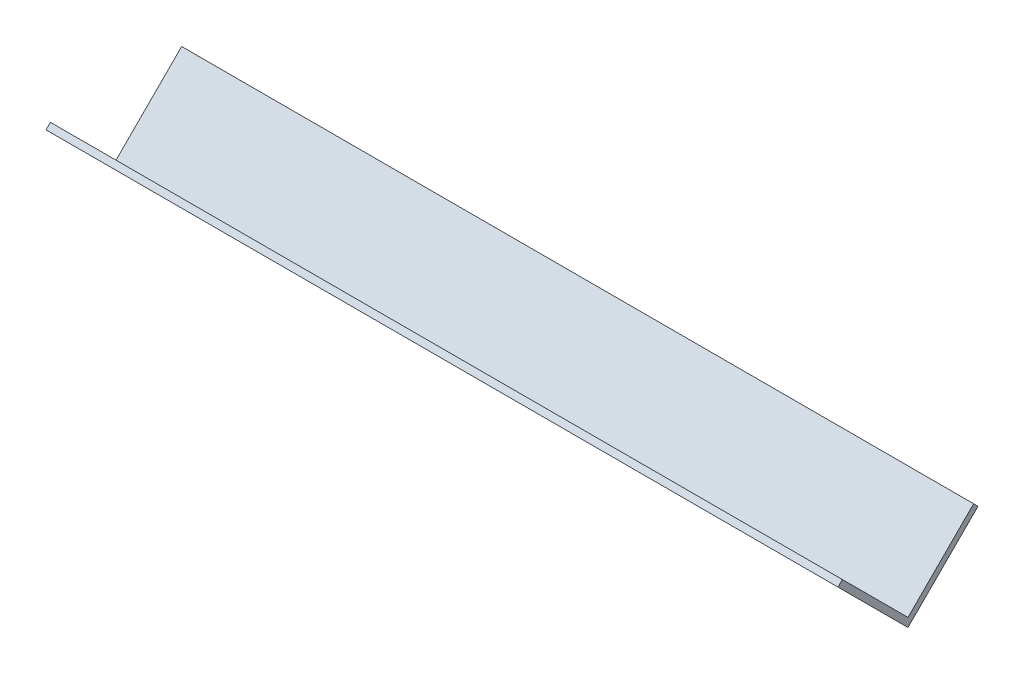
ISO-10303-21;
HEADER;
FILE_DESCRIPTION(('STEP AP214'),'2;1');
FILE_NAME('part.step','',(''),(''),'','','');
FILE_SCHEMA(('AUTOMOTIVE_DESIGN { 1 0 10303 214 1 1 1 1 }'));
ENDSEC;
DATA;
#1=APPLICATION_CONTEXT('core data for automotive mechanical design processes');
#2=APPLICATION_PROTOCOL_DEFINITION('international standard','automotive_design',2000,#1);
#3=PRODUCT_CONTEXT('',#1,'mechanical');
#4=PRODUCT('Part','Part','',(#3));
#5=PRODUCT_RELATED_PRODUCT_CATEGORY('part','',(#4));
#6=PRODUCT_DEFINITION_FORMATION('','',#4);
#7=PRODUCT_DEFINITION_CONTEXT('part definition',#1,'design');
#8=PRODUCT_DEFINITION('design','',#6,#7);
#9=PRODUCT_DEFINITION_SHAPE('','',#8);
#10=(LENGTH_UNIT() NAMED_UNIT(*) SI_UNIT(.MILLI.,.METRE.));
#11=(NAMED_UNIT(*) PLANE_ANGLE_UNIT() SI_UNIT($,.RADIAN.));
#12=(NAMED_UNIT(*) SI_UNIT($,.STERADIAN.) SOLID_ANGLE_UNIT());
#13=UNCERTAINTY_MEASURE_WITH_UNIT(LENGTH_MEASURE(1.E-05),#10,'distance_accuracy_value','');
#14=(GEOMETRIC_REPRESENTATION_CONTEXT(3) GLOBAL_UNCERTAINTY_ASSIGNED_CONTEXT((#13)) GLOBAL_UNIT_ASSIGNED_CONTEXT((#10,
#11,#12)) REPRESENTATION_CONTEXT('',''));
#15=CARTESIAN_POINT('',(0.,0.,0.));
#16=DIRECTION('',(0.,0.,1.));
#17=DIRECTION('',(1.,0.,0.));
#18=AXIS2_PLACEMENT_3D('',#15,#16,#17);
#19=CARTESIAN_POINT('',(406.4,35.9210244842766,-35.9210244842766));
#20=DIRECTION('',(0.,0.707106781186548,0.707106781186548));
#21=DIRECTION('',(0.,-0.707106781186548,0.707106781186548));
#22=AXIS2_PLACEMENT_3D('',#19,#20,#21);
#23=PLANE('',#22);
#24=DIRECTION('',(0.,0.707106781186548,-0.707106781186548));
#25=VECTOR('',#24,1.);
#26=CARTESIAN_POINT('',(0.,35.9210244842766,-35.9210244842766));
#27=LINE('',#26,#25);
#28=CARTESIAN_POINT('',(0.,0.,0.));
#29=VERTEX_POINT('',#28);
#30=CARTESIAN_POINT('',(0.,35.9210244842766,-35.9210244842766));
#31=VERTEX_POINT('',#30);
#32=EDGE_CURVE('E116',#29,#31,#27,.T.);
#33=ORIENTED_EDGE('',*,*,#32,.T.);
#34=DIRECTION('',(-1.,0.,0.));
#35=VECTOR('',#34,1.);
#36=CARTESIAN_POINT('',(406.4,35.9210244842766,-35.9210244842766));
#37=LINE('',#36,#35);
#38=CARTESIAN_POINT('',(406.4,35.9210244842766,-35.9210244842766));
#39=VERTEX_POINT('',#38);
#40=EDGE_CURVE('E11',#39,#31,#37,.T.);
#41=ORIENTED_EDGE('',*,*,#40,.F.);
#42=DIRECTION('',(0.,0.707106781186548,-0.707106781186548));
#43=VECTOR('',#42,1.);
#44=CARTESIAN_POINT('',(406.4,35.9210244842766,-35.9210244842766));
#45=LINE('',#44,#43);
#46=CARTESIAN_POINT('',(406.4,0.,0.));
#47=VERTEX_POINT('',#46);
#48=EDGE_CURVE('E126',#47,#39,#45,.T.);
#49=ORIENTED_EDGE('',*,*,#48,.F.);
#50=DIRECTION('',(-1.,0.,0.));
#51=VECTOR('',#50,1.);
#52=CARTESIAN_POINT('',(406.4,0.,0.));
#53=LINE('',#52,#51);
#54=EDGE_CURVE('E112',#47,#29,#53,.T.);
#55=ORIENTED_EDGE('',*,*,#54,.T.);
#56=EDGE_LOOP('',(#33,#41,#49,#55));
#57=FACE_BOUND('',#56,.T.);
#58=ADVANCED_FACE('F32',(#57),#23,.F.);
#59=CARTESIAN_POINT('',(406.4,38.1660885145439,-33.6759604540093));
#60=DIRECTION('',(0.,-0.707106781186548,0.707106781186548));
#61=DIRECTION('',(0.,-0.707106781186548,-0.707106781186548));
#62=AXIS2_PLACEMENT_3D('',#59,#60,#61);
#63=PLANE('',#62);
#64=DIRECTION('',(0.,0.707106781186548,0.707106781186548));
#65=VECTOR('',#64,1.);
#66=CARTESIAN_POINT('',(0.,38.1660885145439,-33.6759604540093));
#67=LINE('',#66,#65);
#68=CARTESIAN_POINT('',(0.,38.1660885145439,-33.6759604540093));
#69=VERTEX_POINT('',#68);
#70=EDGE_CURVE('E119',#31,#69,#67,.T.);
#71=ORIENTED_EDGE('',*,*,#70,.T.);
#72=DIRECTION('',(-1.,0.,0.));
#73=VECTOR('',#72,1.);
#74=CARTESIAN_POINT('',(406.4,38.1660885145439,-33.6759604540093));
#75=LINE('',#74,#73);
#76=CARTESIAN_POINT('',(406.4,38.1660885145439,-33.6759604540093));
#77=VERTEX_POINT('',#76);
#78=EDGE_CURVE('E40',#77,#69,#75,.T.);
#79=ORIENTED_EDGE('',*,*,#78,.F.);
#80=DIRECTION('',(0.,0.707106781186548,0.707106781186548));
#81=VECTOR('',#80,1.);
#82=CARTESIAN_POINT('',(406.4,38.1660885145439,-33.6759604540093));
#83=LINE('',#82,#81);
#84=EDGE_CURVE('E85',#39,#77,#83,.T.);
#85=ORIENTED_EDGE('',*,*,#84,.F.);
#86=ORIENTED_EDGE('',*,*,#40,.T.);
#87=EDGE_LOOP('',(#71,#79,#85,#86));
#88=FACE_BOUND('',#87,.T.);
#89=ADVANCED_FACE('F150',(#88),#63,.F.);
#90=CARTESIAN_POINT('',(406.4,4.49012806053458,0.));
#91=DIRECTION('',(0.,-0.707106781186547,-0.707106781186548));
#92=DIRECTION('',(0.,0.707106781186548,-0.707106781186547));
#93=AXIS2_PLACEMENT_3D('',#90,#91,#92);
#94=PLANE('',#93);
#95=DIRECTION('',(0.,-0.707106781186548,0.707106781186547));
#96=VECTOR('',#95,1.);
#97=CARTESIAN_POINT('',(0.,4.49012806053458,0.));
#98=LINE('',#97,#96);
#99=CARTESIAN_POINT('',(0.,4.49012806053458,0.));
#100=VERTEX_POINT('',#99);
#101=EDGE_CURVE('E121',#69,#100,#98,.T.);
#102=ORIENTED_EDGE('',*,*,#101,.T.);
#103=DIRECTION('',(-1.,0.,0.));
#104=VECTOR('',#103,1.);
#105=CARTESIAN_POINT('',(406.4,4.49012806053458,0.));
#106=LINE('',#105,#104);
#107=CARTESIAN_POINT('',(406.4,4.49012806053458,0.));
#108=VERTEX_POINT('',#107);
#109=EDGE_CURVE('E107',#108,#100,#106,.T.);
#110=ORIENTED_EDGE('',*,*,#109,.F.);
#111=DIRECTION('',(0.,-0.707106781186548,0.707106781186547));
#112=VECTOR('',#111,1.);
#113=CARTESIAN_POINT('',(406.4,4.49012806053458,0.));
#114=LINE('',#113,#112);
#115=EDGE_CURVE('E98',#77,#108,#114,.T.);
#116=ORIENTED_EDGE('',*,*,#115,.F.);
#117=ORIENTED_EDGE('',*,*,#78,.T.);
#118=EDGE_LOOP('',(#102,#110,#116,#117));
#119=FACE_BOUND('',#118,.T.);
#120=ADVANCED_FACE('F132',(#119),#94,.F.);
#121=CARTESIAN_POINT('',(406.4,38.1660885145439,33.6759604540093));
#122=DIRECTION('',(0.,-0.707106781186548,0.707106781186547));
#123=DIRECTION('',(0.,-0.707106781186547,-0.707106781186548));
#124=AXIS2_PLACEMENT_3D('',#121,#122,#123);
#125=PLANE('',#124);
#126=DIRECTION('',(0.,0.707106781186547,0.707106781186548));
#127=VECTOR('',#126,1.);
#128=CARTESIAN_POINT('',(0.,38.1660885145439,33.6759604540093));
#129=LINE('',#128,#127);
#130=CARTESIAN_POINT('',(0.,38.1660885145439,33.6759604540093));
#131=VERTEX_POINT('',#130);
#132=EDGE_CURVE('E106',#100,#131,#129,.T.);
#133=ORIENTED_EDGE('',*,*,#132,.T.);
#134=DIRECTION('',(-1.,0.,0.));
#135=VECTOR('',#134,1.);
#136=CARTESIAN_POINT('',(406.4,38.1660885145439,33.6759604540093));
#137=LINE('',#136,#135);
#138=CARTESIAN_POINT('',(406.4,38.1660885145439,33.6759604540093));
#139=VERTEX_POINT('',#138);
#140=EDGE_CURVE('E103',#139,#131,#137,.T.);
#141=ORIENTED_EDGE('',*,*,#140,.F.);
#142=DIRECTION('',(0.,0.707106781186547,0.707106781186548));
#143=VECTOR('',#142,1.);
#144=CARTESIAN_POINT('',(406.4,38.1660885145439,33.6759604540093));
#145=LINE('',#144,#143);
#146=EDGE_CURVE('E92',#108,#139,#145,.T.);
#147=ORIENTED_EDGE('',*,*,#146,.F.);
#148=ORIENTED_EDGE('',*,*,#109,.T.);
#149=EDGE_LOOP('',(#133,#141,#147,#148));
#150=FACE_BOUND('',#149,.T.);
#151=ADVANCED_FACE('F104',(#150),#125,.F.);
#152=CARTESIAN_POINT('',(406.4,35.9210244842766,35.9210244842766));
#153=DIRECTION('',(0.,-0.707106781186549,-0.707106781186546));
#154=DIRECTION('',(0.,0.707106781186546,-0.707106781186549));
#155=AXIS2_PLACEMENT_3D('',#152,#153,#154);
#156=PLANE('',#155);
#157=DIRECTION('',(0.,-0.707106781186546,0.707106781186549));
#158=VECTOR('',#157,1.);
#159=CARTESIAN_POINT('',(0.,35.9210244842766,35.9210244842766));
#160=LINE('',#159,#158);
#161=CARTESIAN_POINT('',(0.,35.9210244842766,35.9210244842766));
#162=VERTEX_POINT('',#161);
#163=EDGE_CURVE('E71',#131,#162,#160,.T.);
#164=ORIENTED_EDGE('',*,*,#163,.T.);
#165=DIRECTION('',(-1.,0.,0.));
#166=VECTOR('',#165,1.);
#167=CARTESIAN_POINT('',(406.4,35.9210244842766,35.9210244842766));
#168=LINE('',#167,#166);
#169=CARTESIAN_POINT('',(406.4,35.9210244842766,35.9210244842766));
#170=VERTEX_POINT('',#169);
#171=EDGE_CURVE('E108',#170,#162,#168,.T.);
#172=ORIENTED_EDGE('',*,*,#171,.F.);
#173=DIRECTION('',(0.,-0.707106781186546,0.707106781186549));
#174=VECTOR('',#173,1.);
#175=CARTESIAN_POINT('',(406.4,35.9210244842766,35.9210244842766));
#176=LINE('',#175,#174);
#177=EDGE_CURVE('E96',#139,#170,#176,.T.);
#178=ORIENTED_EDGE('',*,*,#177,.F.);
#179=ORIENTED_EDGE('',*,*,#140,.T.);
#180=EDGE_LOOP('',(#164,#172,#178,#179));
#181=FACE_BOUND('',#180,.T.);
#182=ADVANCED_FACE('F110',(#181),#156,.F.);
#183=CARTESIAN_POINT('',(406.4,0.,0.));
#184=DIRECTION('',(0.,0.707106781186547,-0.707106781186548));
#185=DIRECTION('',(0.,0.707106781186548,0.707106781186547));
#186=AXIS2_PLACEMENT_3D('',#183,#184,#185);
#187=PLANE('',#186);
#188=DIRECTION('',(0.,-0.707106781186548,-0.707106781186547));
#189=VECTOR('',#188,1.);
#190=CARTESIAN_POINT('',(0.,0.,0.));
#191=LINE('',#190,#189);
#192=EDGE_CURVE('E77',#162,#29,#191,.T.);
#193=ORIENTED_EDGE('',*,*,#192,.T.);
#194=ORIENTED_EDGE('',*,*,#54,.F.);
#195=DIRECTION('',(0.,-0.707106781186548,-0.707106781186547));
#196=VECTOR('',#195,1.);
#197=CARTESIAN_POINT('',(406.4,0.,0.));
#198=LINE('',#197,#196);
#199=EDGE_CURVE('E48',#170,#47,#198,.T.);
#200=ORIENTED_EDGE('',*,*,#199,.F.);
#201=ORIENTED_EDGE('',*,*,#171,.T.);
#202=EDGE_LOOP('',(#193,#194,#200,#201));
#203=FACE_BOUND('',#202,.T.);
#204=ADVANCED_FACE('F139',(#203),#187,.F.);
#205=CARTESIAN_POINT('',(406.4,0.,0.));
#206=DIRECTION('',(-1.,0.,0.));
#207=DIRECTION('',(0.,0.,1.));
#208=AXIS2_PLACEMENT_3D('',#205,#206,#207);
#209=PLANE('',#208);
#210=ORIENTED_EDGE('',*,*,#48,.T.);
#211=ORIENTED_EDGE('',*,*,#84,.T.);
#212=ORIENTED_EDGE('',*,*,#115,.T.);
#213=ORIENTED_EDGE('',*,*,#146,.T.);
#214=ORIENTED_EDGE('',*,*,#177,.T.);
#215=ORIENTED_EDGE('',*,*,#199,.T.);
#216=EDGE_LOOP('',(#210,#211,#212,#213,#214,#215));
#217=FACE_BOUND('',#216,.T.);
#218=ADVANCED_FACE('F94',(#217),#209,.F.);
#219=CARTESIAN_POINT('',(0.,0.,0.));
#220=DIRECTION('',(-1.,0.,0.));
#221=DIRECTION('',(0.,0.,1.));
#222=AXIS2_PLACEMENT_3D('',#219,#220,#221);
#223=PLANE('',#222);
#224=ORIENTED_EDGE('',*,*,#32,.F.);
#225=ORIENTED_EDGE('',*,*,#192,.F.);
#226=ORIENTED_EDGE('',*,*,#163,.F.);
#227=ORIENTED_EDGE('',*,*,#132,.F.);
#228=ORIENTED_EDGE('',*,*,#101,.F.);
#229=ORIENTED_EDGE('',*,*,#70,.F.);
#230=EDGE_LOOP('',(#224,#225,#226,#227,#228,#229));
#231=FACE_BOUND('',#230,.T.);
#232=ADVANCED_FACE('F135',(#231),#223,.T.);
#233=CLOSED_SHELL('',(#58,#89,#120,#151,#182,#204,#218,#232));
#234=MANIFOLD_SOLID_BREP('B2',#233);
#235=ADVANCED_BREP_SHAPE_REPRESENTATION('',(#18,#234),#14);
#236=SHAPE_DEFINITION_REPRESENTATION(#9,#235);
ENDSEC;
END-ISO-10303-21;
